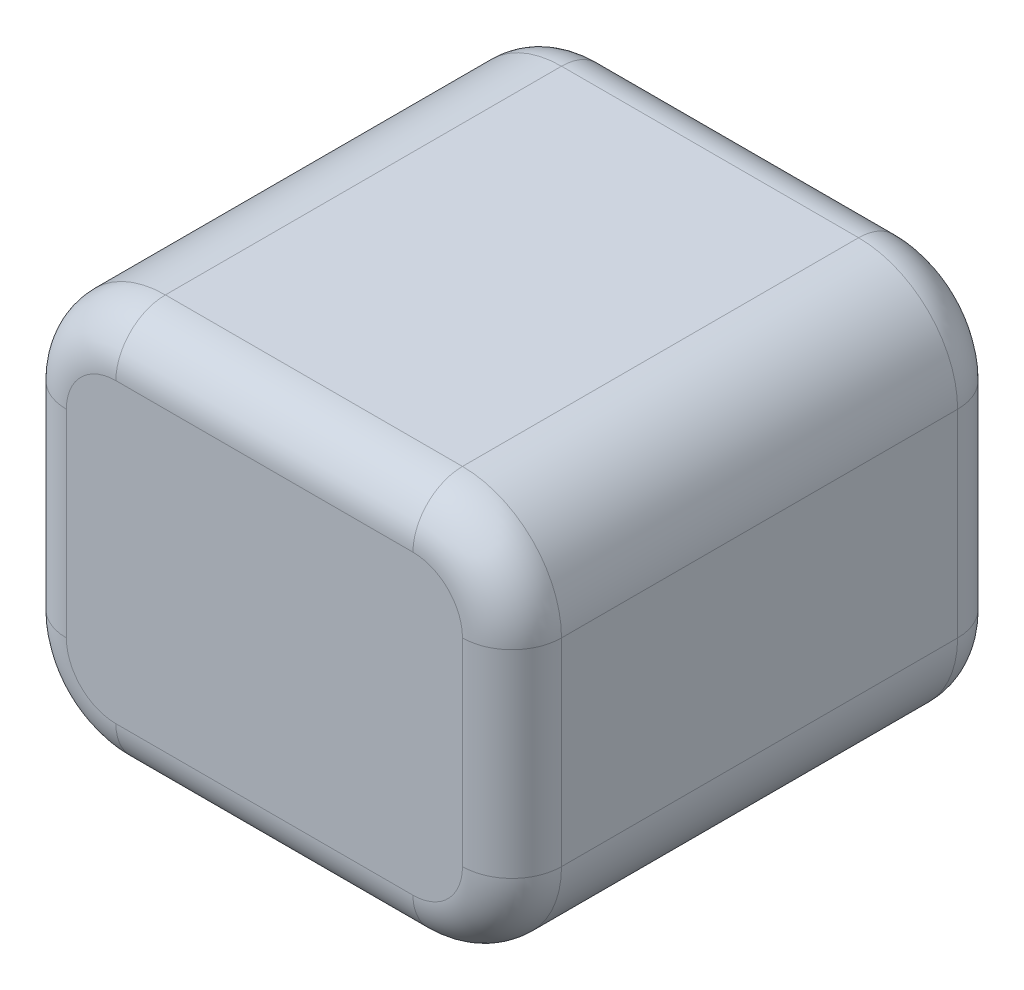
ISO-10303-21;
HEADER;
FILE_DESCRIPTION(('STEP AP214'),'2;1');
FILE_NAME('part.step','',(''),(''),'','','');
FILE_SCHEMA(('AUTOMOTIVE_DESIGN { 1 0 10303 214 1 1 1 1 }'));
ENDSEC;
DATA;
#1=APPLICATION_CONTEXT('core data for automotive mechanical design processes');
#2=APPLICATION_PROTOCOL_DEFINITION('international standard','automotive_design',2000,#1);
#3=PRODUCT_CONTEXT('',#1,'mechanical');
#4=PRODUCT('Part','Part','',(#3));
#5=PRODUCT_RELATED_PRODUCT_CATEGORY('part','',(#4));
#6=PRODUCT_DEFINITION_FORMATION('','',#4);
#7=PRODUCT_DEFINITION_CONTEXT('part definition',#1,'design');
#8=PRODUCT_DEFINITION('design','',#6,#7);
#9=PRODUCT_DEFINITION_SHAPE('','',#8);
#10=(LENGTH_UNIT() NAMED_UNIT(*) SI_UNIT(.MILLI.,.METRE.));
#11=(NAMED_UNIT(*) PLANE_ANGLE_UNIT() SI_UNIT($,.RADIAN.));
#12=(NAMED_UNIT(*) SI_UNIT($,.STERADIAN.) SOLID_ANGLE_UNIT());
#13=UNCERTAINTY_MEASURE_WITH_UNIT(LENGTH_MEASURE(1.E-05),#10,'distance_accuracy_value','');
#14=(GEOMETRIC_REPRESENTATION_CONTEXT(3) GLOBAL_UNCERTAINTY_ASSIGNED_CONTEXT((#13)) GLOBAL_UNIT_ASSIGNED_CONTEXT((#10,
#11,#12)) REPRESENTATION_CONTEXT('',''));
#15=CARTESIAN_POINT('',(0.,0.,0.));
#16=DIRECTION('',(0.,0.,1.));
#17=DIRECTION('',(1.,0.,0.));
#18=AXIS2_PLACEMENT_3D('',#15,#16,#17);
#19=CARTESIAN_POINT('',(100.,80.,100.));
#20=DIRECTION('',(-1.,0.,0.));
#21=DIRECTION('',(0.,0.,1.));
#22=AXIS2_PLACEMENT_3D('',#19,#20,#21);
#23=PLANE('',#22);
#24=DIRECTION('',(0.,0.,-1.));
#25=VECTOR('',#24,1.);
#26=CARTESIAN_POINT('',(100.,60.,100.));
#27=LINE('',#26,#25);
#28=CARTESIAN_POINT('',(100.,60.,9.99999999999999));
#29=VERTEX_POINT('',#28);
#30=CARTESIAN_POINT('',(100.,60.,90.));
#31=VERTEX_POINT('',#30);
#32=EDGE_CURVE('E196',#29,#31,#27,.F.);
#33=ORIENTED_EDGE('',*,*,#32,.T.);
#34=DIRECTION('',(0.,1.,0.));
#35=VECTOR('',#34,1.);
#36=CARTESIAN_POINT('',(100.,80.,90.));
#37=LINE('',#36,#35);
#38=CARTESIAN_POINT('',(100.,20.,90.));
#39=VERTEX_POINT('',#38);
#40=EDGE_CURVE('E252',#31,#39,#37,.F.);
#41=ORIENTED_EDGE('',*,*,#40,.T.);
#42=DIRECTION('',(0.,0.,-1.));
#43=VECTOR('',#42,1.);
#44=CARTESIAN_POINT('',(100.,20.,100.));
#45=LINE('',#44,#43);
#46=CARTESIAN_POINT('',(100.,20.,9.99999999999999));
#47=VERTEX_POINT('',#46);
#48=EDGE_CURVE('E193',#39,#47,#45,.T.);
#49=ORIENTED_EDGE('',*,*,#48,.T.);
#50=DIRECTION('',(0.,1.,0.));
#51=VECTOR('',#50,1.);
#52=CARTESIAN_POINT('',(100.,60.,9.99999999999999));
#53=LINE('',#52,#51);
#54=EDGE_CURVE('E250',#47,#29,#53,.T.);
#55=ORIENTED_EDGE('',*,*,#54,.T.);
#56=EDGE_LOOP('',(#33,#41,#49,#55));
#57=FACE_BOUND('',#56,.T.);
#58=ADVANCED_FACE('F41',(#57),#23,.F.);
#59=CARTESIAN_POINT('',(100.,80.,100.));
#60=DIRECTION('',(0.,-1.,0.));
#61=DIRECTION('',(1.,0.,0.));
#62=AXIS2_PLACEMENT_3D('',#59,#60,#61);
#63=PLANE('',#62);
#64=DIRECTION('',(0.,0.,-1.));
#65=VECTOR('',#64,1.);
#66=CARTESIAN_POINT('',(20.,80.,100.));
#67=LINE('',#66,#65);
#68=CARTESIAN_POINT('',(20.,80.,9.99999999999999));
#69=VERTEX_POINT('',#68);
#70=CARTESIAN_POINT('',(20.,80.,90.));
#71=VERTEX_POINT('',#70);
#72=EDGE_CURVE('E186',#69,#71,#67,.F.);
#73=ORIENTED_EDGE('',*,*,#72,.T.);
#74=DIRECTION('',(-1.,0.,0.));
#75=VECTOR('',#74,1.);
#76=CARTESIAN_POINT('',(100.,80.,90.));
#77=LINE('',#76,#75);
#78=CARTESIAN_POINT('',(80.,80.,90.));
#79=VERTEX_POINT('',#78);
#80=EDGE_CURVE('E244',#71,#79,#77,.F.);
#81=ORIENTED_EDGE('',*,*,#80,.T.);
#82=DIRECTION('',(0.,0.,-1.));
#83=VECTOR('',#82,1.);
#84=CARTESIAN_POINT('',(80.,80.,100.));
#85=LINE('',#84,#83);
#86=CARTESIAN_POINT('',(80.,80.,9.99999999999999));
#87=VERTEX_POINT('',#86);
#88=EDGE_CURVE('E189',#79,#87,#85,.T.);
#89=ORIENTED_EDGE('',*,*,#88,.T.);
#90=DIRECTION('',(-1.,0.,0.));
#91=VECTOR('',#90,1.);
#92=CARTESIAN_POINT('',(20.,80.,9.99999999999999));
#93=LINE('',#92,#91);
#94=EDGE_CURVE('E242',#87,#69,#93,.T.);
#95=ORIENTED_EDGE('',*,*,#94,.T.);
#96=EDGE_LOOP('',(#73,#81,#89,#95));
#97=FACE_BOUND('',#96,.T.);
#98=ADVANCED_FACE('F331',(#97),#63,.F.);
#99=CARTESIAN_POINT('',(0.,80.,100.));
#100=DIRECTION('',(1.,0.,0.));
#101=DIRECTION('',(0.,1.,0.));
#102=AXIS2_PLACEMENT_3D('',#99,#100,#101);
#103=PLANE('',#102);
#104=DIRECTION('',(0.,0.,-1.));
#105=VECTOR('',#104,1.);
#106=CARTESIAN_POINT('',(0.,20.,100.));
#107=LINE('',#106,#105);
#108=CARTESIAN_POINT('',(0.,20.,9.99999999999999));
#109=VERTEX_POINT('',#108);
#110=CARTESIAN_POINT('',(0.,20.,90.));
#111=VERTEX_POINT('',#110);
#112=EDGE_CURVE('E205',#109,#111,#107,.F.);
#113=ORIENTED_EDGE('',*,*,#112,.T.);
#114=DIRECTION('',(0.,-1.,0.));
#115=VECTOR('',#114,1.);
#116=CARTESIAN_POINT('',(0.,80.,90.));
#117=LINE('',#116,#115);
#118=CARTESIAN_POINT('',(0.,60.,90.));
#119=VERTEX_POINT('',#118);
#120=EDGE_CURVE('E236',#111,#119,#117,.F.);
#121=ORIENTED_EDGE('',*,*,#120,.T.);
#122=DIRECTION('',(0.,0.,-1.));
#123=VECTOR('',#122,1.);
#124=CARTESIAN_POINT('',(0.,60.,100.));
#125=LINE('',#124,#123);
#126=CARTESIAN_POINT('',(0.,60.,9.99999999999999));
#127=VERTEX_POINT('',#126);
#128=EDGE_CURVE('E208',#119,#127,#125,.T.);
#129=ORIENTED_EDGE('',*,*,#128,.T.);
#130=DIRECTION('',(0.,-1.,0.));
#131=VECTOR('',#130,1.);
#132=CARTESIAN_POINT('',(0.,20.,9.99999999999999));
#133=LINE('',#132,#131);
#134=EDGE_CURVE('E234',#127,#109,#133,.T.);
#135=ORIENTED_EDGE('',*,*,#134,.T.);
#136=EDGE_LOOP('',(#113,#121,#129,#135));
#137=FACE_BOUND('',#136,.T.);
#138=ADVANCED_FACE('F388',(#137),#103,.F.);
#139=CARTESIAN_POINT('',(100.,0.,100.));
#140=DIRECTION('',(0.,1.,0.));
#141=DIRECTION('',(0.,0.,1.));
#142=AXIS2_PLACEMENT_3D('',#139,#140,#141);
#143=PLANE('',#142);
#144=DIRECTION('',(0.,0.,-1.));
#145=VECTOR('',#144,1.);
#146=CARTESIAN_POINT('',(20.,0.,100.));
#147=LINE('',#146,#145);
#148=CARTESIAN_POINT('',(20.,0.,90.));
#149=VERTEX_POINT('',#148);
#150=CARTESIAN_POINT('',(20.,0.,9.99999999999999));
#151=VERTEX_POINT('',#150);
#152=EDGE_CURVE('E199',#149,#151,#147,.T.);
#153=ORIENTED_EDGE('',*,*,#152,.T.);
#154=CARTESIAN_POINT('',(50.,0.,9.99999999999999));
#155=DIRECTION('',(0.,-1.,0.));
#156=DIRECTION('',(0.,0.,1.));
#157=AXIS2_PLACEMENT_3D('',#154,#155,#156);
#158=ELLIPSE('',#157,70.,30.);
#159=CARTESIAN_POINT('',(80.,0.,9.99999999999999));
#160=VERTEX_POINT('',#159);
#161=EDGE_CURVE('E169',#160,#151,#158,.T.);
#162=ORIENTED_EDGE('',*,*,#161,.F.);
#163=DIRECTION('',(0.,0.,-1.));
#164=VECTOR('',#163,1.);
#165=CARTESIAN_POINT('',(80.,0.,100.));
#166=LINE('',#165,#164);
#167=CARTESIAN_POINT('',(80.,0.,90.));
#168=VERTEX_POINT('',#167);
#169=EDGE_CURVE('E202',#160,#168,#166,.F.);
#170=ORIENTED_EDGE('',*,*,#169,.T.);
#171=DIRECTION('',(1.,0.,0.));
#172=VECTOR('',#171,1.);
#173=CARTESIAN_POINT('',(100.,0.,90.));
#174=LINE('',#173,#172);
#175=EDGE_CURVE('E11',#168,#149,#174,.F.);
#176=ORIENTED_EDGE('',*,*,#175,.T.);
#177=EDGE_LOOP('',(#153,#162,#170,#176));
#178=FACE_BOUND('',#177,.T.);
#179=ADVANCED_FACE('F375',(#178),#143,.F.);
#180=CARTESIAN_POINT('',(0.,0.,100.));
#181=DIRECTION('',(0.,0.,-1.));
#182=DIRECTION('',(-1.,0.,0.));
#183=AXIS2_PLACEMENT_3D('',#180,#181,#182);
#184=PLANE('',#183);
#185=DIRECTION('',(0.,-1.,0.));
#186=VECTOR('',#185,1.);
#187=CARTESIAN_POINT('',(10.,0.,100.));
#188=LINE('',#187,#186);
#189=CARTESIAN_POINT('',(10.,60.,100.));
#190=VERTEX_POINT('',#189);
#191=CARTESIAN_POINT('',(10.,20.,100.));
#192=VERTEX_POINT('',#191);
#193=EDGE_CURVE('E223',#190,#192,#188,.T.);
#194=ORIENTED_EDGE('',*,*,#193,.T.);
#195=CARTESIAN_POINT('',(20.,20.,100.));
#196=DIRECTION('',(0.,0.,-1.));
#197=DIRECTION('',(-1.,0.,0.));
#198=AXIS2_PLACEMENT_3D('',#195,#196,#197);
#199=CIRCLE('',#198,10.);
#200=CARTESIAN_POINT('',(20.,10.,100.));
#201=VERTEX_POINT('',#200);
#202=EDGE_CURVE('E225',#192,#201,#199,.F.);
#203=ORIENTED_EDGE('',*,*,#202,.T.);
#204=DIRECTION('',(1.,0.,0.));
#205=VECTOR('',#204,1.);
#206=CARTESIAN_POINT('',(0.,10.,100.));
#207=LINE('',#206,#205);
#208=CARTESIAN_POINT('',(80.,10.,100.));
#209=VERTEX_POINT('',#208);
#210=EDGE_CURVE('E211',#201,#209,#207,.T.);
#211=ORIENTED_EDGE('',*,*,#210,.T.);
#212=CARTESIAN_POINT('',(80.,20.,100.));
#213=DIRECTION('',(0.,0.,-1.));
#214=DIRECTION('',(-1.,0.,0.));
#215=AXIS2_PLACEMENT_3D('',#212,#213,#214);
#216=CIRCLE('',#215,10.);
#217=CARTESIAN_POINT('',(90.,20.,100.));
#218=VERTEX_POINT('',#217);
#219=EDGE_CURVE('E213',#209,#218,#216,.F.);
#220=ORIENTED_EDGE('',*,*,#219,.T.);
#221=DIRECTION('',(0.,1.,0.));
#222=VECTOR('',#221,1.);
#223=CARTESIAN_POINT('',(90.,0.,100.));
#224=LINE('',#223,#222);
#225=CARTESIAN_POINT('',(90.,60.,100.));
#226=VERTEX_POINT('',#225);
#227=EDGE_CURVE('E215',#218,#226,#224,.T.);
#228=ORIENTED_EDGE('',*,*,#227,.T.);
#229=CARTESIAN_POINT('',(80.,60.,100.));
#230=DIRECTION('',(0.,0.,-1.));
#231=DIRECTION('',(-1.,0.,0.));
#232=AXIS2_PLACEMENT_3D('',#229,#230,#231);
#233=CIRCLE('',#232,10.);
#234=CARTESIAN_POINT('',(80.,70.,100.));
#235=VERTEX_POINT('',#234);
#236=EDGE_CURVE('E217',#226,#235,#233,.F.);
#237=ORIENTED_EDGE('',*,*,#236,.T.);
#238=DIRECTION('',(-1.,0.,0.));
#239=VECTOR('',#238,1.);
#240=CARTESIAN_POINT('',(0.,70.,100.));
#241=LINE('',#240,#239);
#242=CARTESIAN_POINT('',(20.,70.,100.));
#243=VERTEX_POINT('',#242);
#244=EDGE_CURVE('E219',#235,#243,#241,.T.);
#245=ORIENTED_EDGE('',*,*,#244,.T.);
#246=CARTESIAN_POINT('',(20.,60.,100.));
#247=DIRECTION('',(0.,0.,-1.));
#248=DIRECTION('',(-1.,0.,0.));
#249=AXIS2_PLACEMENT_3D('',#246,#247,#248);
#250=CIRCLE('',#249,10.);
#251=EDGE_CURVE('E221',#243,#190,#250,.F.);
#252=ORIENTED_EDGE('',*,*,#251,.T.);
#253=EDGE_LOOP('',(#194,#203,#211,#220,#228,#237,#245,#252));
#254=FACE_BOUND('',#253,.T.);
#255=ADVANCED_FACE('F346',(#254),#184,.F.);
#256=CARTESIAN_POINT('',(0.,0.,0.));
#257=DIRECTION('',(0.,0.,-1.));
#258=DIRECTION('',(-1.,0.,0.));
#259=AXIS2_PLACEMENT_3D('',#256,#257,#258);
#260=PLANE('',#259);
#261=DIRECTION('',(1.,0.,0.));
#262=VECTOR('',#261,1.);
#263=CARTESIAN_POINT('',(20.,10.,0.));
#264=LINE('',#263,#262);
#265=CARTESIAN_POINT('',(80.,10.,0.));
#266=VERTEX_POINT('',#265);
#267=CARTESIAN_POINT('',(20.,10.,0.));
#268=VERTEX_POINT('',#267);
#269=EDGE_CURVE('E258',#266,#268,#264,.F.);
#270=ORIENTED_EDGE('',*,*,#269,.T.);
#271=CARTESIAN_POINT('',(20.,20.,0.));
#272=DIRECTION('',(0.,0.,-1.));
#273=DIRECTION('',(-1.,0.,0.));
#274=AXIS2_PLACEMENT_3D('',#271,#272,#273);
#275=CIRCLE('',#274,10.);
#276=CARTESIAN_POINT('',(10.,20.,0.));
#277=VERTEX_POINT('',#276);
#278=EDGE_CURVE('E271',#268,#277,#275,.T.);
#279=ORIENTED_EDGE('',*,*,#278,.T.);
#280=DIRECTION('',(0.,-1.,0.));
#281=VECTOR('',#280,1.);
#282=CARTESIAN_POINT('',(10.,60.,0.));
#283=LINE('',#282,#281);
#284=CARTESIAN_POINT('',(10.,60.,0.));
#285=VERTEX_POINT('',#284);
#286=EDGE_CURVE('E65',#277,#285,#283,.F.);
#287=ORIENTED_EDGE('',*,*,#286,.T.);
#288=CARTESIAN_POINT('',(20.,60.,0.));
#289=DIRECTION('',(0.,0.,-1.));
#290=DIRECTION('',(-1.,0.,0.));
#291=AXIS2_PLACEMENT_3D('',#288,#289,#290);
#292=CIRCLE('',#291,10.);
#293=CARTESIAN_POINT('',(20.,70.,0.));
#294=VERTEX_POINT('',#293);
#295=EDGE_CURVE('E268',#285,#294,#292,.T.);
#296=ORIENTED_EDGE('',*,*,#295,.T.);
#297=DIRECTION('',(-1.,0.,0.));
#298=VECTOR('',#297,1.);
#299=CARTESIAN_POINT('',(80.,70.,0.));
#300=LINE('',#299,#298);
#301=CARTESIAN_POINT('',(80.,70.,0.));
#302=VERTEX_POINT('',#301);
#303=EDGE_CURVE('E266',#294,#302,#300,.F.);
#304=ORIENTED_EDGE('',*,*,#303,.T.);
#305=CARTESIAN_POINT('',(80.,60.,0.));
#306=DIRECTION('',(0.,0.,-1.));
#307=DIRECTION('',(-1.,0.,0.));
#308=AXIS2_PLACEMENT_3D('',#305,#306,#307);
#309=CIRCLE('',#308,10.);
#310=CARTESIAN_POINT('',(90.,60.,0.));
#311=VERTEX_POINT('',#310);
#312=EDGE_CURVE('E264',#302,#311,#309,.T.);
#313=ORIENTED_EDGE('',*,*,#312,.T.);
#314=DIRECTION('',(0.,1.,0.));
#315=VECTOR('',#314,1.);
#316=CARTESIAN_POINT('',(90.,20.,0.));
#317=LINE('',#316,#315);
#318=CARTESIAN_POINT('',(90.,20.,0.));
#319=VERTEX_POINT('',#318);
#320=EDGE_CURVE('E262',#311,#319,#317,.F.);
#321=ORIENTED_EDGE('',*,*,#320,.T.);
#322=CARTESIAN_POINT('',(80.,20.,0.));
#323=DIRECTION('',(0.,0.,-1.));
#324=DIRECTION('',(-1.,0.,0.));
#325=AXIS2_PLACEMENT_3D('',#322,#323,#324);
#326=CIRCLE('',#325,10.);
#327=EDGE_CURVE('E260',#319,#266,#326,.T.);
#328=ORIENTED_EDGE('',*,*,#327,.T.);
#329=EDGE_LOOP('',(#270,#279,#287,#296,#304,#313,#321,#328));
#330=FACE_BOUND('',#329,.T.);
#331=ADVANCED_FACE('F409',(#330),#260,.T.);
#332=CARTESIAN_POINT('',(80.,60.,100.));
#333=DIRECTION('',(0.,0.,-1.));
#334=DIRECTION('',(-1.,0.,0.));
#335=AXIS2_PLACEMENT_3D('',#332,#333,#334);
#336=CYLINDRICAL_SURFACE('',#335,20.);
#337=ORIENTED_EDGE('',*,*,#88,.F.);
#338=CARTESIAN_POINT('',(80.,60.,90.));
#339=DIRECTION('',(0.,0.,-1.));
#340=DIRECTION('',(-1.,0.,0.));
#341=AXIS2_PLACEMENT_3D('',#338,#339,#340);
#342=CIRCLE('',#341,20.);
#343=EDGE_CURVE('E248',#79,#31,#342,.T.);
#344=ORIENTED_EDGE('',*,*,#343,.T.);
#345=ORIENTED_EDGE('',*,*,#32,.F.);
#346=CARTESIAN_POINT('',(80.,60.,9.99999999999999));
#347=DIRECTION('',(0.,0.,-1.));
#348=DIRECTION('',(-1.,0.,0.));
#349=AXIS2_PLACEMENT_3D('',#346,#347,#348);
#350=CIRCLE('',#349,20.);
#351=EDGE_CURVE('E246',#29,#87,#350,.F.);
#352=ORIENTED_EDGE('',*,*,#351,.T.);
#353=EDGE_LOOP('',(#337,#344,#345,#352));
#354=FACE_BOUND('',#353,.T.);
#355=ADVANCED_FACE('F328',(#354),#336,.T.);
#356=CARTESIAN_POINT('',(80.,20.,100.));
#357=DIRECTION('',(0.,0.,-1.));
#358=DIRECTION('',(-1.,0.,0.));
#359=AXIS2_PLACEMENT_3D('',#356,#357,#358);
#360=CYLINDRICAL_SURFACE('',#359,20.);
#361=ORIENTED_EDGE('',*,*,#48,.F.);
#362=CARTESIAN_POINT('',(80.,20.,90.));
#363=DIRECTION('',(0.,0.,-1.));
#364=DIRECTION('',(-1.,0.,0.));
#365=AXIS2_PLACEMENT_3D('',#362,#363,#364);
#366=CIRCLE('',#365,20.);
#367=EDGE_CURVE('E256',#39,#168,#366,.T.);
#368=ORIENTED_EDGE('',*,*,#367,.T.);
#369=ORIENTED_EDGE('',*,*,#169,.F.);
#370=CARTESIAN_POINT('',(80.,20.,9.99999999999999));
#371=DIRECTION('',(0.,0.,-1.));
#372=DIRECTION('',(-1.,0.,0.));
#373=AXIS2_PLACEMENT_3D('',#370,#371,#372);
#374=CIRCLE('',#373,20.);
#375=EDGE_CURVE('E254',#160,#47,#374,.F.);
#376=ORIENTED_EDGE('',*,*,#375,.T.);
#377=EDGE_LOOP('',(#361,#368,#369,#376));
#378=FACE_BOUND('',#377,.T.);
#379=ADVANCED_FACE('F358',(#378),#360,.T.);
#380=CARTESIAN_POINT('',(20.,60.,100.));
#381=DIRECTION('',(0.,0.,-1.));
#382=DIRECTION('',(-1.,0.,0.));
#383=AXIS2_PLACEMENT_3D('',#380,#381,#382);
#384=CYLINDRICAL_SURFACE('',#383,20.);
#385=ORIENTED_EDGE('',*,*,#128,.F.);
#386=CARTESIAN_POINT('',(20.,60.,90.));
#387=DIRECTION('',(0.,0.,-1.));
#388=DIRECTION('',(-1.,0.,0.));
#389=AXIS2_PLACEMENT_3D('',#386,#387,#388);
#390=CIRCLE('',#389,20.);
#391=EDGE_CURVE('E240',#119,#71,#390,.T.);
#392=ORIENTED_EDGE('',*,*,#391,.T.);
#393=ORIENTED_EDGE('',*,*,#72,.F.);
#394=CARTESIAN_POINT('',(20.,60.,9.99999999999999));
#395=DIRECTION('',(0.,0.,-1.));
#396=DIRECTION('',(-1.,0.,0.));
#397=AXIS2_PLACEMENT_3D('',#394,#395,#396);
#398=CIRCLE('',#397,20.);
#399=EDGE_CURVE('E238',#69,#127,#398,.F.);
#400=ORIENTED_EDGE('',*,*,#399,.T.);
#401=EDGE_LOOP('',(#385,#392,#393,#400));
#402=FACE_BOUND('',#401,.T.);
#403=ADVANCED_FACE('F391',(#402),#384,.T.);
#404=CARTESIAN_POINT('',(20.,20.,100.));
#405=DIRECTION('',(0.,0.,-1.));
#406=DIRECTION('',(-1.,0.,0.));
#407=AXIS2_PLACEMENT_3D('',#404,#405,#406);
#408=CYLINDRICAL_SURFACE('',#407,20.);
#409=ORIENTED_EDGE('',*,*,#152,.F.);
#410=CARTESIAN_POINT('',(20.,20.,90.));
#411=DIRECTION('',(0.,0.,-1.));
#412=DIRECTION('',(-1.,0.,0.));
#413=AXIS2_PLACEMENT_3D('',#410,#411,#412);
#414=CIRCLE('',#413,20.);
#415=EDGE_CURVE('E231',#149,#111,#414,.T.);
#416=ORIENTED_EDGE('',*,*,#415,.T.);
#417=ORIENTED_EDGE('',*,*,#112,.F.);
#418=CARTESIAN_POINT('',(20.,20.,9.99999999999999));
#419=DIRECTION('',(0.,0.,-1.));
#420=DIRECTION('',(-1.,0.,0.));
#421=AXIS2_PLACEMENT_3D('',#418,#419,#420);
#422=CIRCLE('',#421,20.);
#423=EDGE_CURVE('E228',#109,#151,#422,.F.);
#424=ORIENTED_EDGE('',*,*,#423,.T.);
#425=EDGE_LOOP('',(#409,#416,#417,#424));
#426=FACE_BOUND('',#425,.T.);
#427=ADVANCED_FACE('F378',(#426),#408,.T.);
#428=CARTESIAN_POINT('',(80.,60.,90.));
#429=DIRECTION('',(0.,0.,-1.));
#430=DIRECTION('',(-1.,0.,0.));
#431=AXIS2_PLACEMENT_3D('',#428,#429,#430);
#432=DEGENERATE_TOROIDAL_SURFACE('',#431,10.,10.,.T.);
#433=CARTESIAN_POINT('',(90.,60.,90.));
#434=DIRECTION('',(0.,-1.,0.));
#435=DIRECTION('',(0.,0.,-1.));
#436=AXIS2_PLACEMENT_3D('',#433,#434,#435);
#437=CIRCLE('',#436,10.);
#438=EDGE_CURVE('E290',#31,#226,#437,.T.);
#439=ORIENTED_EDGE('',*,*,#438,.F.);
#440=ORIENTED_EDGE('',*,*,#343,.F.);
#441=CARTESIAN_POINT('',(80.,70.,90.));
#442=DIRECTION('',(-1.,0.,0.));
#443=DIRECTION('',(0.,0.,1.));
#444=AXIS2_PLACEMENT_3D('',#441,#442,#443);
#445=CIRCLE('',#444,10.);
#446=EDGE_CURVE('E190',#235,#79,#445,.T.);
#447=ORIENTED_EDGE('',*,*,#446,.F.);
#448=ORIENTED_EDGE('',*,*,#236,.F.);
#449=EDGE_LOOP('',(#439,#440,#447,#448));
#450=FACE_BOUND('',#449,.T.);
#451=ADVANCED_FACE('F352',(#450),#432,.T.);
#452=CARTESIAN_POINT('',(0.,70.,90.));
#453=DIRECTION('',(-1.,0.,0.));
#454=DIRECTION('',(0.,-1.,0.));
#455=AXIS2_PLACEMENT_3D('',#452,#453,#454);
#456=CYLINDRICAL_SURFACE('',#455,10.);
#457=ORIENTED_EDGE('',*,*,#446,.T.);
#458=ORIENTED_EDGE('',*,*,#80,.F.);
#459=CARTESIAN_POINT('',(20.,70.,90.));
#460=DIRECTION('',(-1.,0.,0.));
#461=DIRECTION('',(0.,-1.,0.));
#462=AXIS2_PLACEMENT_3D('',#459,#460,#461);
#463=CIRCLE('',#462,10.);
#464=EDGE_CURVE('E287',#243,#71,#463,.T.);
#465=ORIENTED_EDGE('',*,*,#464,.F.);
#466=ORIENTED_EDGE('',*,*,#244,.F.);
#467=EDGE_LOOP('',(#457,#458,#465,#466));
#468=FACE_BOUND('',#467,.T.);
#469=ADVANCED_FACE('F336',(#468),#456,.T.);
#470=CARTESIAN_POINT('',(90.,0.,90.));
#471=DIRECTION('',(0.,1.,0.));
#472=DIRECTION('',(0.,0.,1.));
#473=AXIS2_PLACEMENT_3D('',#470,#471,#472);
#474=CYLINDRICAL_SURFACE('',#473,10.);
#475=ORIENTED_EDGE('',*,*,#438,.T.);
#476=ORIENTED_EDGE('',*,*,#227,.F.);
#477=CARTESIAN_POINT('',(90.,20.,90.));
#478=DIRECTION('',(0.,-1.,0.));
#479=DIRECTION('',(0.,0.,-1.));
#480=AXIS2_PLACEMENT_3D('',#477,#478,#479);
#481=CIRCLE('',#480,10.);
#482=EDGE_CURVE('E284',#39,#218,#481,.T.);
#483=ORIENTED_EDGE('',*,*,#482,.F.);
#484=ORIENTED_EDGE('',*,*,#40,.F.);
#485=EDGE_LOOP('',(#475,#476,#483,#484));
#486=FACE_BOUND('',#485,.T.);
#487=ADVANCED_FACE('F363',(#486),#474,.T.);
#488=CARTESIAN_POINT('',(20.,60.,90.));
#489=DIRECTION('',(0.,0.,-1.));
#490=DIRECTION('',(-1.,0.,0.));
#491=AXIS2_PLACEMENT_3D('',#488,#489,#490);
#492=DEGENERATE_TOROIDAL_SURFACE('',#491,10.,10.,.T.);
#493=ORIENTED_EDGE('',*,*,#464,.T.);
#494=ORIENTED_EDGE('',*,*,#391,.F.);
#495=CARTESIAN_POINT('',(10.,60.,90.));
#496=DIRECTION('',(0.,-1.,0.));
#497=DIRECTION('',(0.,0.,-1.));
#498=AXIS2_PLACEMENT_3D('',#495,#496,#497);
#499=CIRCLE('',#498,10.);
#500=EDGE_CURVE('E281',#190,#119,#499,.T.);
#501=ORIENTED_EDGE('',*,*,#500,.F.);
#502=ORIENTED_EDGE('',*,*,#251,.F.);
#503=EDGE_LOOP('',(#493,#494,#501,#502));
#504=FACE_BOUND('',#503,.T.);
#505=ADVANCED_FACE('F342',(#504),#492,.T.);
#506=CARTESIAN_POINT('',(80.,20.,90.));
#507=DIRECTION('',(0.,0.,-1.));
#508=DIRECTION('',(-1.,0.,0.));
#509=AXIS2_PLACEMENT_3D('',#506,#507,#508);
#510=DEGENERATE_TOROIDAL_SURFACE('',#509,10.,10.,.T.);
#511=ORIENTED_EDGE('',*,*,#482,.T.);
#512=ORIENTED_EDGE('',*,*,#219,.F.);
#513=CARTESIAN_POINT('',(80.,10.,90.));
#514=DIRECTION('',(-1.,0.,0.));
#515=DIRECTION('',(0.,0.,1.));
#516=AXIS2_PLACEMENT_3D('',#513,#514,#515);
#517=CIRCLE('',#516,10.);
#518=EDGE_CURVE('E278',#168,#209,#517,.T.);
#519=ORIENTED_EDGE('',*,*,#518,.F.);
#520=ORIENTED_EDGE('',*,*,#367,.F.);
#521=EDGE_LOOP('',(#511,#512,#519,#520));
#522=FACE_BOUND('',#521,.T.);
#523=ADVANCED_FACE('F367',(#522),#510,.T.);
#524=CARTESIAN_POINT('',(10.,0.,90.));
#525=DIRECTION('',(0.,-1.,0.));
#526=DIRECTION('',(1.,0.,0.));
#527=AXIS2_PLACEMENT_3D('',#524,#525,#526);
#528=CYLINDRICAL_SURFACE('',#527,10.);
#529=ORIENTED_EDGE('',*,*,#500,.T.);
#530=ORIENTED_EDGE('',*,*,#120,.F.);
#531=CARTESIAN_POINT('',(10.,20.,90.));
#532=DIRECTION('',(0.,-1.,0.));
#533=DIRECTION('',(0.,0.,-1.));
#534=AXIS2_PLACEMENT_3D('',#531,#532,#533);
#535=CIRCLE('',#534,10.);
#536=EDGE_CURVE('E276',#192,#111,#535,.T.);
#537=ORIENTED_EDGE('',*,*,#536,.F.);
#538=ORIENTED_EDGE('',*,*,#193,.F.);
#539=EDGE_LOOP('',(#529,#530,#537,#538));
#540=FACE_BOUND('',#539,.T.);
#541=ADVANCED_FACE('F385',(#540),#528,.T.);
#542=CARTESIAN_POINT('',(0.,10.,90.));
#543=DIRECTION('',(1.,0.,0.));
#544=DIRECTION('',(0.,0.,-1.));
#545=AXIS2_PLACEMENT_3D('',#542,#543,#544);
#546=CYLINDRICAL_SURFACE('',#545,10.);
#547=ORIENTED_EDGE('',*,*,#518,.T.);
#548=ORIENTED_EDGE('',*,*,#210,.F.);
#549=CARTESIAN_POINT('',(20.,10.,90.));
#550=DIRECTION('',(-1.,0.,0.));
#551=DIRECTION('',(0.,0.,1.));
#552=AXIS2_PLACEMENT_3D('',#549,#550,#551);
#553=CIRCLE('',#552,10.);
#554=EDGE_CURVE('E274',#149,#201,#553,.T.);
#555=ORIENTED_EDGE('',*,*,#554,.F.);
#556=ORIENTED_EDGE('',*,*,#175,.F.);
#557=EDGE_LOOP('',(#547,#548,#555,#556));
#558=FACE_BOUND('',#557,.T.);
#559=ADVANCED_FACE('F372',(#558),#546,.T.);
#560=CARTESIAN_POINT('',(20.,20.,90.));
#561=DIRECTION('',(0.,0.,-1.));
#562=DIRECTION('',(-1.,0.,0.));
#563=AXIS2_PLACEMENT_3D('',#560,#561,#562);
#564=DEGENERATE_TOROIDAL_SURFACE('',#563,10.,10.,.T.);
#565=ORIENTED_EDGE('',*,*,#536,.T.);
#566=ORIENTED_EDGE('',*,*,#415,.F.);
#567=ORIENTED_EDGE('',*,*,#554,.T.);
#568=ORIENTED_EDGE('',*,*,#202,.F.);
#569=EDGE_LOOP('',(#565,#566,#567,#568));
#570=FACE_BOUND('',#569,.T.);
#571=ADVANCED_FACE('F381',(#570),#564,.T.);
#572=CARTESIAN_POINT('',(80.,60.,9.99999999999999));
#573=DIRECTION('',(0.,0.,-1.));
#574=DIRECTION('',(-1.,0.,0.));
#575=AXIS2_PLACEMENT_3D('',#572,#573,#574);
#576=DEGENERATE_TOROIDAL_SURFACE('',#575,10.,10.,.T.);
#577=CARTESIAN_POINT('',(80.,70.,9.99999999999999));
#578=DIRECTION('',(-1.,0.,0.));
#579=DIRECTION('',(0.,0.,1.));
#580=AXIS2_PLACEMENT_3D('',#577,#578,#579);
#581=CIRCLE('',#580,10.);
#582=EDGE_CURVE('E309',#87,#302,#581,.T.);
#583=ORIENTED_EDGE('',*,*,#582,.F.);
#584=ORIENTED_EDGE('',*,*,#351,.F.);
#585=CARTESIAN_POINT('',(90.,60.,10.));
#586=DIRECTION('',(0.,-1.,0.));
#587=DIRECTION('',(0.,0.,-1.));
#588=AXIS2_PLACEMENT_3D('',#585,#586,#587);
#589=CIRCLE('',#588,10.);
#590=EDGE_CURVE('E45',#311,#29,#589,.T.);
#591=ORIENTED_EDGE('',*,*,#590,.F.);
#592=ORIENTED_EDGE('',*,*,#312,.F.);
#593=EDGE_LOOP('',(#583,#584,#591,#592));
#594=FACE_BOUND('',#593,.T.);
#595=ADVANCED_FACE('F43',(#594),#576,.T.);
#596=CARTESIAN_POINT('',(90.,80.,9.99999999999999));
#597=DIRECTION('',(0.,-1.,0.));
#598=DIRECTION('',(0.,0.,-1.));
#599=AXIS2_PLACEMENT_3D('',#596,#597,#598);
#600=CYLINDRICAL_SURFACE('',#599,10.);
#601=ORIENTED_EDGE('',*,*,#590,.T.);
#602=ORIENTED_EDGE('',*,*,#54,.F.);
#603=CARTESIAN_POINT('',(90.,20.,10.));
#604=DIRECTION('',(0.,-1.,0.));
#605=DIRECTION('',(0.,0.,-1.));
#606=AXIS2_PLACEMENT_3D('',#603,#604,#605);
#607=CIRCLE('',#606,10.);
#608=EDGE_CURVE('E307',#319,#47,#607,.T.);
#609=ORIENTED_EDGE('',*,*,#608,.F.);
#610=ORIENTED_EDGE('',*,*,#320,.F.);
#611=EDGE_LOOP('',(#601,#602,#609,#610));
#612=FACE_BOUND('',#611,.T.);
#613=ADVANCED_FACE('F320',(#612),#600,.T.);
#614=CARTESIAN_POINT('',(100.,70.,9.99999999999999));
#615=DIRECTION('',(1.,0.,0.));
#616=DIRECTION('',(0.,1.,0.));
#617=AXIS2_PLACEMENT_3D('',#614,#615,#616);
#618=CYLINDRICAL_SURFACE('',#617,10.);
#619=ORIENTED_EDGE('',*,*,#582,.T.);
#620=ORIENTED_EDGE('',*,*,#303,.F.);
#621=CARTESIAN_POINT('',(20.,70.,9.99999999999999));
#622=DIRECTION('',(-1.,0.,0.));
#623=DIRECTION('',(0.,0.,1.));
#624=AXIS2_PLACEMENT_3D('',#621,#622,#623);
#625=CIRCLE('',#624,10.);
#626=EDGE_CURVE('E304',#69,#294,#625,.T.);
#627=ORIENTED_EDGE('',*,*,#626,.F.);
#628=ORIENTED_EDGE('',*,*,#94,.F.);
#629=EDGE_LOOP('',(#619,#620,#627,#628));
#630=FACE_BOUND('',#629,.T.);
#631=ADVANCED_FACE('F410',(#630),#618,.T.);
#632=CARTESIAN_POINT('',(80.,20.,9.99999999999999));
#633=DIRECTION('',(0.,0.,-1.));
#634=DIRECTION('',(-1.,0.,0.));
#635=AXIS2_PLACEMENT_3D('',#632,#633,#634);
#636=DEGENERATE_TOROIDAL_SURFACE('',#635,10.,10.,.T.);
#637=ORIENTED_EDGE('',*,*,#608,.T.);
#638=ORIENTED_EDGE('',*,*,#375,.F.);
#639=CARTESIAN_POINT('',(80.,10.,10.));
#640=DIRECTION('',(-1.,0.,0.));
#641=DIRECTION('',(0.,0.,1.));
#642=AXIS2_PLACEMENT_3D('',#639,#640,#641);
#643=CIRCLE('',#642,10.);
#644=EDGE_CURVE('E301',#266,#160,#643,.T.);
#645=ORIENTED_EDGE('',*,*,#644,.F.);
#646=ORIENTED_EDGE('',*,*,#327,.F.);
#647=EDGE_LOOP('',(#637,#638,#645,#646));
#648=FACE_BOUND('',#647,.T.);
#649=ADVANCED_FACE('F407',(#648),#636,.T.);
#650=CARTESIAN_POINT('',(20.,60.,9.99999999999999));
#651=DIRECTION('',(0.,0.,-1.));
#652=DIRECTION('',(-1.,0.,0.));
#653=AXIS2_PLACEMENT_3D('',#650,#651,#652);
#654=DEGENERATE_TOROIDAL_SURFACE('',#653,10.,10.,.T.);
#655=ORIENTED_EDGE('',*,*,#626,.T.);
#656=ORIENTED_EDGE('',*,*,#295,.F.);
#657=CARTESIAN_POINT('',(10.,60.,9.99999999999999));
#658=DIRECTION('',(0.,-1.,0.));
#659=DIRECTION('',(0.,0.,-1.));
#660=AXIS2_PLACEMENT_3D('',#657,#658,#659);
#661=CIRCLE('',#660,10.);
#662=EDGE_CURVE('E298',#127,#285,#661,.T.);
#663=ORIENTED_EDGE('',*,*,#662,.F.);
#664=ORIENTED_EDGE('',*,*,#399,.F.);
#665=EDGE_LOOP('',(#655,#656,#663,#664));
#666=FACE_BOUND('',#665,.T.);
#667=ADVANCED_FACE('F395',(#666),#654,.T.);
#668=CARTESIAN_POINT('',(100.,10.,9.99999999999999));
#669=DIRECTION('',(-1.,0.,0.));
#670=DIRECTION('',(0.,0.,1.));
#671=AXIS2_PLACEMENT_3D('',#668,#669,#670);
#672=CYLINDRICAL_SURFACE('',#671,10.);
#673=ORIENTED_EDGE('',*,*,#644,.T.);
#674=DIRECTION('',(1.,0.,0.));
#675=VECTOR('',#674,1.);
#676=CARTESIAN_POINT('',(80.,0.,9.99999999999999));
#677=LINE('',#676,#675);
#678=EDGE_CURVE('E50',#151,#160,#677,.T.);
#679=ORIENTED_EDGE('',*,*,#678,.F.);
#680=CARTESIAN_POINT('',(20.,10.,10.));
#681=DIRECTION('',(-1.,0.,0.));
#682=DIRECTION('',(0.,0.,1.));
#683=AXIS2_PLACEMENT_3D('',#680,#681,#682);
#684=CIRCLE('',#683,10.);
#685=EDGE_CURVE('E296',#268,#151,#684,.T.);
#686=ORIENTED_EDGE('',*,*,#685,.F.);
#687=ORIENTED_EDGE('',*,*,#269,.F.);
#688=EDGE_LOOP('',(#673,#679,#686,#687));
#689=FACE_BOUND('',#688,.T.);
#690=ADVANCED_FACE('F404',(#689),#672,.T.);
#691=CARTESIAN_POINT('',(10.,80.,9.99999999999999));
#692=DIRECTION('',(0.,1.,0.));
#693=DIRECTION('',(-1.,0.,0.));
#694=AXIS2_PLACEMENT_3D('',#691,#692,#693);
#695=CYLINDRICAL_SURFACE('',#694,10.);
#696=ORIENTED_EDGE('',*,*,#662,.T.);
#697=ORIENTED_EDGE('',*,*,#286,.F.);
#698=CARTESIAN_POINT('',(10.,20.,9.99999999999999));
#699=DIRECTION('',(0.,-1.,0.));
#700=DIRECTION('',(0.,0.,-1.));
#701=AXIS2_PLACEMENT_3D('',#698,#699,#700);
#702=CIRCLE('',#701,10.);
#703=EDGE_CURVE('E58',#109,#277,#702,.T.);
#704=ORIENTED_EDGE('',*,*,#703,.F.);
#705=ORIENTED_EDGE('',*,*,#134,.F.);
#706=EDGE_LOOP('',(#696,#697,#704,#705));
#707=FACE_BOUND('',#706,.T.);
#708=ADVANCED_FACE('F398',(#707),#695,.T.);
#709=CARTESIAN_POINT('',(20.,20.,9.99999999999999));
#710=DIRECTION('',(0.,0.,-1.));
#711=DIRECTION('',(-1.,0.,0.));
#712=AXIS2_PLACEMENT_3D('',#709,#710,#711);
#713=DEGENERATE_TOROIDAL_SURFACE('',#712,10.,10.,.T.);
#714=ORIENTED_EDGE('',*,*,#685,.T.);
#715=ORIENTED_EDGE('',*,*,#423,.F.);
#716=ORIENTED_EDGE('',*,*,#703,.T.);
#717=ORIENTED_EDGE('',*,*,#278,.F.);
#718=EDGE_LOOP('',(#714,#715,#716,#717));
#719=FACE_BOUND('',#718,.T.);
#720=ADVANCED_FACE('F399',(#719),#713,.T.);
#721=CARTESIAN_POINT('',(50.,5.,9.99999999999999));
#722=DIRECTION('',(0.,-1.,0.));
#723=DIRECTION('',(0.,0.,1.));
#724=AXIS2_PLACEMENT_3D('',#721,#722,#723);
#725=ELLIPSE('',#724,70.,30.);
#726=DIRECTION('',(0.,-1.,0.));
#727=VECTOR('',#726,1.);
#728=SURFACE_OF_LINEAR_EXTRUSION('',#725,#727);
#729=ORIENTED_EDGE('',*,*,#161,.T.);
#730=DIRECTION('',(0.,-1.,0.));
#731=VECTOR('',#730,1.);
#732=CARTESIAN_POINT('',(20.,5.,9.99999999999999));
#733=LINE('',#732,#731);
#734=CARTESIAN_POINT('',(20.,5.,9.99999999999999));
#735=VERTEX_POINT('',#734);
#736=EDGE_CURVE('E163',#735,#151,#733,.T.);
#737=ORIENTED_EDGE('',*,*,#736,.F.);
#738=CARTESIAN_POINT('',(80.,5.,9.99999999999999));
#739=VERTEX_POINT('',#738);
#740=EDGE_CURVE('E166',#739,#735,#725,.T.);
#741=ORIENTED_EDGE('',*,*,#740,.F.);
#742=DIRECTION('',(0.,-1.,0.));
#743=VECTOR('',#742,1.);
#744=CARTESIAN_POINT('',(80.,5.,9.99999999999999));
#745=LINE('',#744,#743);
#746=EDGE_CURVE('E174',#739,#160,#745,.T.);
#747=ORIENTED_EDGE('',*,*,#746,.T.);
#748=EDGE_LOOP('',(#729,#737,#741,#747));
#749=FACE_BOUND('',#748,.T.);
#750=ADVANCED_FACE('F165',(#749),#728,.F.);
#751=CARTESIAN_POINT('',(20.,5.,9.99999999999999));
#752=DIRECTION('',(0.,0.,-1.));
#753=DIRECTION('',(-1.,0.,0.));
#754=AXIS2_PLACEMENT_3D('',#751,#752,#753);
#755=PLANE('',#754);
#756=ORIENTED_EDGE('',*,*,#678,.T.);
#757=ORIENTED_EDGE('',*,*,#746,.F.);
#758=DIRECTION('',(1.,0.,0.));
#759=VECTOR('',#758,1.);
#760=CARTESIAN_POINT('',(20.,5.,9.99999999999999));
#761=LINE('',#760,#759);
#762=EDGE_CURVE('E175',#735,#739,#761,.T.);
#763=ORIENTED_EDGE('',*,*,#762,.F.);
#764=ORIENTED_EDGE('',*,*,#736,.T.);
#765=EDGE_LOOP('',(#756,#757,#763,#764));
#766=FACE_BOUND('',#765,.T.);
#767=ADVANCED_FACE('F180',(#766),#755,.F.);
#768=CARTESIAN_POINT('',(50.,5.,9.99999999999999));
#769=DIRECTION('',(0.,-1.,0.));
#770=DIRECTION('',(0.,0.,-1.));
#771=AXIS2_PLACEMENT_3D('',#768,#769,#770);
#772=PLANE('',#771);
#773=ORIENTED_EDGE('',*,*,#740,.T.);
#774=ORIENTED_EDGE('',*,*,#762,.T.);
#775=EDGE_LOOP('',(#773,#774));
#776=FACE_BOUND('',#775,.T.);
#777=ADVANCED_FACE('F178',(#776),#772,.T.);
#778=CLOSED_SHELL('',(#58,#98,#138,#179,#255,#331,#355,#379,#403,#427,#451,#469,#487,#505,#523,
#541,#559,#571,#595,#613,#631,#649,#667,#690,#708,#720,#750,#767,#777));
#779=MANIFOLD_SOLID_BREP('B2',#778);
#780=ADVANCED_BREP_SHAPE_REPRESENTATION('',(#18,#779),#14);
#781=SHAPE_DEFINITION_REPRESENTATION(#9,#780);
ENDSEC;
END-ISO-10303-21;
